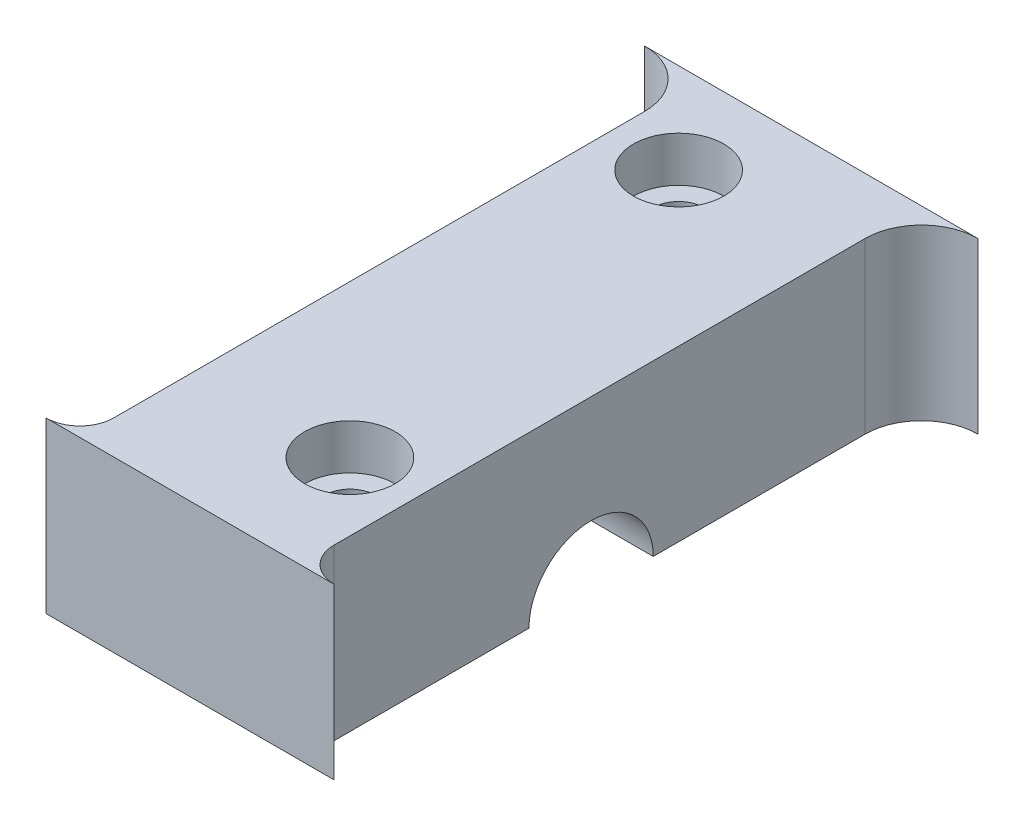
ISO-10303-21;
HEADER;
FILE_DESCRIPTION(('STEP AP214'),'2;1');
FILE_NAME('part.step','',(''),(''),'','','');
FILE_SCHEMA(('AUTOMOTIVE_DESIGN { 1 0 10303 214 1 1 1 1 }'));
ENDSEC;
DATA;
#1=APPLICATION_CONTEXT('core data for automotive mechanical design processes');
#2=APPLICATION_PROTOCOL_DEFINITION('international standard','automotive_design',2000,#1);
#3=PRODUCT_CONTEXT('',#1,'mechanical');
#4=PRODUCT('Part','Part','',(#3));
#5=PRODUCT_RELATED_PRODUCT_CATEGORY('part','',(#4));
#6=PRODUCT_DEFINITION_FORMATION('','',#4);
#7=PRODUCT_DEFINITION_CONTEXT('part definition',#1,'design');
#8=PRODUCT_DEFINITION('design','',#6,#7);
#9=PRODUCT_DEFINITION_SHAPE('','',#8);
#10=(LENGTH_UNIT() NAMED_UNIT(*) SI_UNIT(.MILLI.,.METRE.));
#11=(NAMED_UNIT(*) PLANE_ANGLE_UNIT() SI_UNIT($,.RADIAN.));
#12=(NAMED_UNIT(*) SI_UNIT($,.STERADIAN.) SOLID_ANGLE_UNIT());
#13=UNCERTAINTY_MEASURE_WITH_UNIT(LENGTH_MEASURE(1.E-05),#10,'distance_accuracy_value','');
#14=(GEOMETRIC_REPRESENTATION_CONTEXT(3) GLOBAL_UNCERTAINTY_ASSIGNED_CONTEXT((#13)) GLOBAL_UNIT_ASSIGNED_CONTEXT((#10,
#11,#12)) REPRESENTATION_CONTEXT('',''));
#15=CARTESIAN_POINT('',(0.,0.,0.));
#16=DIRECTION('',(0.,0.,1.));
#17=DIRECTION('',(1.,0.,0.));
#18=AXIS2_PLACEMENT_3D('',#15,#16,#17);
#19=CARTESIAN_POINT('',(-2.00000000000001,0.,-25.75));
#20=DIRECTION('',(1.,0.,0.));
#21=DIRECTION('',(0.,0.,-1.));
#22=AXIS2_PLACEMENT_3D('',#19,#20,#21);
#23=CYLINDRICAL_SURFACE('',#22,5.5);
#24=CARTESIAN_POINT('',(10.75,0.,-25.75));
#25=DIRECTION('',(1.,0.,0.));
#26=DIRECTION('',(0.,0.,-1.));
#27=AXIS2_PLACEMENT_3D('',#24,#25,#26);
#28=CIRCLE('',#27,5.5);
#29=CARTESIAN_POINT('',(10.75,0.,-20.25));
#30=VERTEX_POINT('',#29);
#31=CARTESIAN_POINT('',(10.75,0.,-31.25));
#32=VERTEX_POINT('',#31);
#33=EDGE_CURVE('E143',#30,#32,#28,.F.);
#34=ORIENTED_EDGE('',*,*,#33,.F.);
#35=DIRECTION('',(1.,0.,0.));
#36=VECTOR('',#35,1.);
#37=CARTESIAN_POINT('',(-2.00000000000001,0.,-20.25));
#38=LINE('',#37,#36);
#39=CARTESIAN_POINT('',(3.,0.,-20.25));
#40=VERTEX_POINT('',#39);
#41=EDGE_CURVE('E240',#40,#30,#38,.T.);
#42=ORIENTED_EDGE('',*,*,#41,.F.);
#43=CARTESIAN_POINT('',(3.,0.,-25.75));
#44=DIRECTION('',(1.,0.,0.));
#45=DIRECTION('',(0.,0.,-1.));
#46=AXIS2_PLACEMENT_3D('',#43,#44,#45);
#47=CIRCLE('',#46,5.5);
#48=CARTESIAN_POINT('',(3.,0.,-31.25));
#49=VERTEX_POINT('',#48);
#50=EDGE_CURVE('E170',#49,#40,#47,.T.);
#51=ORIENTED_EDGE('',*,*,#50,.F.);
#52=DIRECTION('',(1.,0.,0.));
#53=VECTOR('',#52,1.);
#54=CARTESIAN_POINT('',(-2.00000000000001,0.,-31.25));
#55=LINE('',#54,#53);
#56=EDGE_CURVE('E62',#32,#49,#55,.F.);
#57=ORIENTED_EDGE('',*,*,#56,.F.);
#58=EDGE_LOOP('',(#34,#42,#51,#57));
#59=FACE_BOUND('',#58,.T.);
#60=ADVANCED_FACE('F39',(#59),#23,.F.);
#61=CARTESIAN_POINT('',(0.,0.,-3.));
#62=DIRECTION('',(0.,1.,0.));
#63=DIRECTION('',(0.,0.,1.));
#64=AXIS2_PLACEMENT_3D('',#61,#62,#63);
#65=PLANE('',#64);
#66=CARTESIAN_POINT('',(16.5,0.,-10.4));
#67=DIRECTION('',(0.,1.,0.));
#68=DIRECTION('',(0.,0.,1.));
#69=AXIS2_PLACEMENT_3D('',#66,#67,#68);
#70=CIRCLE('',#69,2.25);
#71=CARTESIAN_POINT('',(16.5,0.,-8.15));
#72=VERTEX_POINT('',#71);
#73=EDGE_CURVE('E357',#72,#72,#70,.T.);
#74=ORIENTED_EDGE('',*,*,#73,.T.);
#75=EDGE_LOOP('',(#74));
#76=FACE_BOUND('',#75,.T.);
#77=DIRECTION('',(-1.,0.,0.));
#78=VECTOR('',#77,1.);
#79=CARTESIAN_POINT('',(14.75,0.,-14.25));
#80=LINE('',#79,#78);
#81=CARTESIAN_POINT('',(14.75,0.,-14.25));
#82=VERTEX_POINT('',#81);
#83=CARTESIAN_POINT('',(10.75,0.,-14.25));
#84=VERTEX_POINT('',#83);
#85=EDGE_CURVE('E152',#82,#84,#80,.T.);
#86=ORIENTED_EDGE('',*,*,#85,.F.);
#87=DIRECTION('',(0.,0.,-1.));
#88=VECTOR('',#87,1.);
#89=CARTESIAN_POINT('',(14.75,0.,-3.));
#90=LINE('',#89,#88);
#91=CARTESIAN_POINT('',(14.75,0.,-20.25));
#92=VERTEX_POINT('',#91);
#93=EDGE_CURVE('E163',#82,#92,#90,.T.);
#94=ORIENTED_EDGE('',*,*,#93,.T.);
#95=CARTESIAN_POINT('',(22.5,0.,-20.25));
#96=VERTEX_POINT('',#95);
#97=EDGE_CURVE('E239',#92,#96,#38,.T.);
#98=ORIENTED_EDGE('',*,*,#97,.T.);
#99=DIRECTION('',(0.,0.,-1.));
#100=VECTOR('',#99,1.);
#101=CARTESIAN_POINT('',(22.5,0.,-50.));
#102=LINE('',#101,#100);
#103=CARTESIAN_POINT('',(22.5,0.,-3.));
#104=VERTEX_POINT('',#103);
#105=EDGE_CURVE('E203',#104,#96,#102,.T.);
#106=ORIENTED_EDGE('',*,*,#105,.F.);
#107=CARTESIAN_POINT('',(25.5,0.,-3.));
#108=DIRECTION('',(0.,-1.,0.));
#109=DIRECTION('',(0.,0.,-1.));
#110=AXIS2_PLACEMENT_3D('',#107,#108,#109);
#111=CIRCLE('',#110,3.);
#112=CARTESIAN_POINT('',(25.5,0.,0.));
#113=VERTEX_POINT('',#112);
#114=EDGE_CURVE('E200',#113,#104,#111,.T.);
#115=ORIENTED_EDGE('',*,*,#114,.F.);
#116=DIRECTION('',(1.,0.,0.));
#117=VECTOR('',#116,1.);
#118=CARTESIAN_POINT('',(0.,0.,0.));
#119=LINE('',#118,#117);
#120=CARTESIAN_POINT('',(0.,0.,0.));
#121=VERTEX_POINT('',#120);
#122=EDGE_CURVE('E198',#121,#113,#119,.T.);
#123=ORIENTED_EDGE('',*,*,#122,.F.);
#124=CARTESIAN_POINT('',(0.,0.,-3.));
#125=DIRECTION('',(0.,-1.,0.));
#126=DIRECTION('',(0.,0.,1.));
#127=AXIS2_PLACEMENT_3D('',#124,#125,#126);
#128=CIRCLE('',#127,3.);
#129=CARTESIAN_POINT('',(3.,0.,-3.));
#130=VERTEX_POINT('',#129);
#131=EDGE_CURVE('E176',#130,#121,#128,.T.);
#132=ORIENTED_EDGE('',*,*,#131,.F.);
#133=DIRECTION('',(0.,0.,1.));
#134=VECTOR('',#133,1.);
#135=CARTESIAN_POINT('',(2.99999999999999,0.,-50.));
#136=LINE('',#135,#134);
#137=EDGE_CURVE('E212',#40,#130,#136,.T.);
#138=ORIENTED_EDGE('',*,*,#137,.F.);
#139=ORIENTED_EDGE('',*,*,#41,.T.);
#140=DIRECTION('',(0.,0.,-1.));
#141=VECTOR('',#140,1.);
#142=CARTESIAN_POINT('',(10.75,0.,-3.));
#143=LINE('',#142,#141);
#144=EDGE_CURVE('E54',#84,#30,#143,.T.);
#145=ORIENTED_EDGE('',*,*,#144,.F.);
#146=EDGE_LOOP('',(#86,#94,#98,#106,#115,#123,#132,#138,#139,#145));
#147=FACE_BOUND('',#146,.T.);
#148=ADVANCED_FACE('F249',(#76,#147),#65,.F.);
#149=CARTESIAN_POINT('',(0.,15.,-3.));
#150=DIRECTION('',(0.,-1.,0.));
#151=DIRECTION('',(0.,0.,-1.));
#152=AXIS2_PLACEMENT_3D('',#149,#150,#151);
#153=CYLINDRICAL_SURFACE('',#152,3.);
#154=ORIENTED_EDGE('',*,*,#131,.T.);
#155=DIRECTION('',(0.,-1.,0.));
#156=VECTOR('',#155,1.);
#157=CARTESIAN_POINT('',(0.,15.,0.));
#158=LINE('',#157,#156);
#159=CARTESIAN_POINT('',(0.,15.,0.));
#160=VERTEX_POINT('',#159);
#161=EDGE_CURVE('E235',#160,#121,#158,.T.);
#162=ORIENTED_EDGE('',*,*,#161,.F.);
#163=CARTESIAN_POINT('',(0.,15.,-3.));
#164=DIRECTION('',(0.,-1.,0.));
#165=DIRECTION('',(0.,0.,1.));
#166=AXIS2_PLACEMENT_3D('',#163,#164,#165);
#167=CIRCLE('',#166,3.);
#168=CARTESIAN_POINT('',(3.,15.,-3.));
#169=VERTEX_POINT('',#168);
#170=EDGE_CURVE('E177',#169,#160,#167,.T.);
#171=ORIENTED_EDGE('',*,*,#170,.F.);
#172=DIRECTION('',(0.,-1.,0.));
#173=VECTOR('',#172,1.);
#174=CARTESIAN_POINT('',(3.,15.,-3.));
#175=LINE('',#174,#173);
#176=EDGE_CURVE('E195',#169,#130,#175,.T.);
#177=ORIENTED_EDGE('',*,*,#176,.T.);
#178=EDGE_LOOP('',(#154,#162,#171,#177));
#179=FACE_BOUND('',#178,.T.);
#180=ADVANCED_FACE('F41',(#179),#153,.F.);
#181=CARTESIAN_POINT('',(0.,15.,0.));
#182=DIRECTION('',(0.,0.,-1.));
#183=DIRECTION('',(-1.,0.,0.));
#184=AXIS2_PLACEMENT_3D('',#181,#182,#183);
#185=PLANE('',#184);
#186=ORIENTED_EDGE('',*,*,#122,.T.);
#187=DIRECTION('',(0.,-1.,0.));
#188=VECTOR('',#187,1.);
#189=CARTESIAN_POINT('',(25.5,15.,0.));
#190=LINE('',#189,#188);
#191=CARTESIAN_POINT('',(25.5,15.,0.));
#192=VERTEX_POINT('',#191);
#193=EDGE_CURVE('E232',#192,#113,#190,.T.);
#194=ORIENTED_EDGE('',*,*,#193,.F.);
#195=DIRECTION('',(1.,0.,0.));
#196=VECTOR('',#195,1.);
#197=CARTESIAN_POINT('',(0.,15.,0.));
#198=LINE('',#197,#196);
#199=EDGE_CURVE('E180',#160,#192,#198,.T.);
#200=ORIENTED_EDGE('',*,*,#199,.F.);
#201=ORIENTED_EDGE('',*,*,#161,.T.);
#202=EDGE_LOOP('',(#186,#194,#200,#201));
#203=FACE_BOUND('',#202,.T.);
#204=ADVANCED_FACE('F284',(#203),#185,.F.);
#205=CARTESIAN_POINT('',(25.5,15.,-3.));
#206=DIRECTION('',(0.,-1.,0.));
#207=DIRECTION('',(0.,0.,-1.));
#208=AXIS2_PLACEMENT_3D('',#205,#206,#207);
#209=CYLINDRICAL_SURFACE('',#208,3.);
#210=ORIENTED_EDGE('',*,*,#114,.T.);
#211=DIRECTION('',(0.,-1.,0.));
#212=VECTOR('',#211,1.);
#213=CARTESIAN_POINT('',(22.5,15.,-3.));
#214=LINE('',#213,#212);
#215=CARTESIAN_POINT('',(22.5,15.,-3.));
#216=VERTEX_POINT('',#215);
#217=EDGE_CURVE('E229',#216,#104,#214,.T.);
#218=ORIENTED_EDGE('',*,*,#217,.F.);
#219=CARTESIAN_POINT('',(25.5,15.,-3.));
#220=DIRECTION('',(0.,-1.,0.));
#221=DIRECTION('',(0.,0.,-1.));
#222=AXIS2_PLACEMENT_3D('',#219,#220,#221);
#223=CIRCLE('',#222,3.);
#224=EDGE_CURVE('E183',#192,#216,#223,.T.);
#225=ORIENTED_EDGE('',*,*,#224,.F.);
#226=ORIENTED_EDGE('',*,*,#193,.T.);
#227=EDGE_LOOP('',(#210,#218,#225,#226));
#228=FACE_BOUND('',#227,.T.);
#229=ADVANCED_FACE('F280',(#228),#209,.F.);
#230=CARTESIAN_POINT('',(22.5,15.,-50.));
#231=DIRECTION('',(-1.,0.,0.));
#232=DIRECTION('',(0.,0.,1.));
#233=AXIS2_PLACEMENT_3D('',#230,#231,#232);
#234=PLANE('',#233);
#235=ORIENTED_EDGE('',*,*,#105,.T.);
#236=CARTESIAN_POINT('',(22.5,0.,-25.75));
#237=DIRECTION('',(-1.,0.,0.));
#238=DIRECTION('',(0.,0.,1.));
#239=AXIS2_PLACEMENT_3D('',#236,#237,#238);
#240=CIRCLE('',#239,5.5);
#241=CARTESIAN_POINT('',(22.5,0.,-31.25));
#242=VERTEX_POINT('',#241);
#243=EDGE_CURVE('E173',#96,#242,#240,.T.);
#244=ORIENTED_EDGE('',*,*,#243,.T.);
#245=CARTESIAN_POINT('',(22.5,0.,-50.));
#246=VERTEX_POINT('',#245);
#247=EDGE_CURVE('E202',#242,#246,#102,.T.);
#248=ORIENTED_EDGE('',*,*,#247,.T.);
#249=DIRECTION('',(0.,-1.,0.));
#250=VECTOR('',#249,1.);
#251=CARTESIAN_POINT('',(22.5,15.,-50.));
#252=LINE('',#251,#250);
#253=CARTESIAN_POINT('',(22.5,15.,-50.));
#254=VERTEX_POINT('',#253);
#255=EDGE_CURVE('E226',#254,#246,#252,.T.);
#256=ORIENTED_EDGE('',*,*,#255,.F.);
#257=DIRECTION('',(0.,0.,-1.));
#258=VECTOR('',#257,1.);
#259=CARTESIAN_POINT('',(22.5,15.,-50.));
#260=LINE('',#259,#258);
#261=EDGE_CURVE('E185',#216,#254,#260,.T.);
#262=ORIENTED_EDGE('',*,*,#261,.F.);
#263=ORIENTED_EDGE('',*,*,#217,.T.);
#264=EDGE_LOOP('',(#235,#244,#248,#256,#262,#263));
#265=FACE_BOUND('',#264,.T.);
#266=ADVANCED_FACE('F275',(#265),#234,.F.);
#267=CARTESIAN_POINT('',(27.5,15.,-50.));
#268=DIRECTION('',(0.,-1.,0.));
#269=DIRECTION('',(0.,0.,-1.));
#270=AXIS2_PLACEMENT_3D('',#267,#268,#269);
#271=CYLINDRICAL_SURFACE('',#270,5.);
#272=CARTESIAN_POINT('',(27.5,0.,-50.));
#273=DIRECTION('',(0.,-1.,0.));
#274=DIRECTION('',(0.,0.,1.));
#275=AXIS2_PLACEMENT_3D('',#272,#273,#274);
#276=CIRCLE('',#275,5.);
#277=CARTESIAN_POINT('',(27.5,0.,-55.));
#278=VERTEX_POINT('',#277);
#279=EDGE_CURVE('E206',#246,#278,#276,.T.);
#280=ORIENTED_EDGE('',*,*,#279,.T.);
#281=DIRECTION('',(0.,-1.,0.));
#282=VECTOR('',#281,1.);
#283=CARTESIAN_POINT('',(27.5,15.,-55.));
#284=LINE('',#283,#282);
#285=CARTESIAN_POINT('',(27.5,15.,-55.));
#286=VERTEX_POINT('',#285);
#287=EDGE_CURVE('E223',#286,#278,#284,.T.);
#288=ORIENTED_EDGE('',*,*,#287,.F.);
#289=CARTESIAN_POINT('',(27.5,15.,-50.));
#290=DIRECTION('',(0.,-1.,0.));
#291=DIRECTION('',(0.,0.,1.));
#292=AXIS2_PLACEMENT_3D('',#289,#290,#291);
#293=CIRCLE('',#292,5.);
#294=EDGE_CURVE('E187',#254,#286,#293,.T.);
#295=ORIENTED_EDGE('',*,*,#294,.F.);
#296=ORIENTED_EDGE('',*,*,#255,.T.);
#297=EDGE_LOOP('',(#280,#288,#295,#296));
#298=FACE_BOUND('',#297,.T.);
#299=ADVANCED_FACE('F272',(#298),#271,.F.);
#300=CARTESIAN_POINT('',(27.5,15.,-55.));
#301=DIRECTION('',(0.,0.,1.));
#302=DIRECTION('',(1.,0.,0.));
#303=AXIS2_PLACEMENT_3D('',#300,#301,#302);
#304=PLANE('',#303);
#305=DIRECTION('',(-1.,0.,0.));
#306=VECTOR('',#305,1.);
#307=CARTESIAN_POINT('',(27.5,0.,-55.));
#308=LINE('',#307,#306);
#309=CARTESIAN_POINT('',(-2.00000000000001,0.,-55.));
#310=VERTEX_POINT('',#309);
#311=EDGE_CURVE('E208',#278,#310,#308,.T.);
#312=ORIENTED_EDGE('',*,*,#311,.T.);
#313=DIRECTION('',(0.,-1.,0.));
#314=VECTOR('',#313,1.);
#315=CARTESIAN_POINT('',(-2.00000000000001,15.,-55.));
#316=LINE('',#315,#314);
#317=CARTESIAN_POINT('',(-2.00000000000001,15.,-55.));
#318=VERTEX_POINT('',#317);
#319=EDGE_CURVE('E220',#318,#310,#316,.T.);
#320=ORIENTED_EDGE('',*,*,#319,.F.);
#321=DIRECTION('',(-1.,0.,0.));
#322=VECTOR('',#321,1.);
#323=CARTESIAN_POINT('',(27.5,15.,-55.));
#324=LINE('',#323,#322);
#325=EDGE_CURVE('E189',#286,#318,#324,.T.);
#326=ORIENTED_EDGE('',*,*,#325,.F.);
#327=ORIENTED_EDGE('',*,*,#287,.T.);
#328=EDGE_LOOP('',(#312,#320,#326,#327));
#329=FACE_BOUND('',#328,.T.);
#330=ADVANCED_FACE('F268',(#329),#304,.F.);
#331=CARTESIAN_POINT('',(-2.,15.,-50.));
#332=DIRECTION('',(0.,-1.,0.));
#333=DIRECTION('',(0.,0.,-1.));
#334=AXIS2_PLACEMENT_3D('',#331,#332,#333);
#335=CYLINDRICAL_SURFACE('',#334,5.);
#336=CARTESIAN_POINT('',(-2.,0.,-50.));
#337=DIRECTION('',(0.,-1.,0.));
#338=DIRECTION('',(0.,0.,-1.));
#339=AXIS2_PLACEMENT_3D('',#336,#337,#338);
#340=CIRCLE('',#339,5.);
#341=CARTESIAN_POINT('',(2.99999999999999,0.,-50.));
#342=VERTEX_POINT('',#341);
#343=EDGE_CURVE('E210',#310,#342,#340,.T.);
#344=ORIENTED_EDGE('',*,*,#343,.T.);
#345=DIRECTION('',(0.,-1.,0.));
#346=VECTOR('',#345,1.);
#347=CARTESIAN_POINT('',(2.99999999999999,15.,-50.));
#348=LINE('',#347,#346);
#349=CARTESIAN_POINT('',(2.99999999999999,15.,-50.));
#350=VERTEX_POINT('',#349);
#351=EDGE_CURVE('E217',#350,#342,#348,.T.);
#352=ORIENTED_EDGE('',*,*,#351,.F.);
#353=CARTESIAN_POINT('',(-2.,15.,-50.));
#354=DIRECTION('',(0.,-1.,0.));
#355=DIRECTION('',(0.,0.,-1.));
#356=AXIS2_PLACEMENT_3D('',#353,#354,#355);
#357=CIRCLE('',#356,5.);
#358=EDGE_CURVE('E191',#318,#350,#357,.T.);
#359=ORIENTED_EDGE('',*,*,#358,.F.);
#360=ORIENTED_EDGE('',*,*,#319,.T.);
#361=EDGE_LOOP('',(#344,#352,#359,#360));
#362=FACE_BOUND('',#361,.T.);
#363=ADVANCED_FACE('F263',(#362),#335,.F.);
#364=CARTESIAN_POINT('',(2.99999999999999,15.,-50.));
#365=DIRECTION('',(1.,0.,0.));
#366=DIRECTION('',(0.,0.,-1.));
#367=AXIS2_PLACEMENT_3D('',#364,#365,#366);
#368=PLANE('',#367);
#369=EDGE_CURVE('E181',#342,#49,#136,.T.);
#370=ORIENTED_EDGE('',*,*,#369,.T.);
#371=ORIENTED_EDGE('',*,*,#50,.T.);
#372=ORIENTED_EDGE('',*,*,#137,.T.);
#373=ORIENTED_EDGE('',*,*,#176,.F.);
#374=DIRECTION('',(0.,0.,1.));
#375=VECTOR('',#374,1.);
#376=CARTESIAN_POINT('',(2.99999999999999,15.,-50.));
#377=LINE('',#376,#375);
#378=EDGE_CURVE('E193',#350,#169,#377,.T.);
#379=ORIENTED_EDGE('',*,*,#378,.F.);
#380=ORIENTED_EDGE('',*,*,#351,.T.);
#381=EDGE_LOOP('',(#370,#371,#372,#373,#379,#380));
#382=FACE_BOUND('',#381,.T.);
#383=ADVANCED_FACE('F255',(#382),#368,.F.);
#384=CARTESIAN_POINT('',(0.,15.,-3.));
#385=DIRECTION('',(0.,1.,0.));
#386=DIRECTION('',(0.,0.,1.));
#387=AXIS2_PLACEMENT_3D('',#384,#385,#386);
#388=PLANE('',#387);
#389=CARTESIAN_POINT('',(16.5,15.,-10.4));
#390=DIRECTION('',(0.,1.,0.));
#391=DIRECTION('',(0.,0.,1.));
#392=AXIS2_PLACEMENT_3D('',#389,#390,#391);
#393=CIRCLE('',#392,4.);
#394=CARTESIAN_POINT('',(16.5,15.,-6.4));
#395=VERTEX_POINT('',#394);
#396=EDGE_CURVE('E350',#395,#395,#393,.T.);
#397=ORIENTED_EDGE('',*,*,#396,.F.);
#398=EDGE_LOOP('',(#397));
#399=FACE_BOUND('',#398,.T.);
#400=CARTESIAN_POINT('',(8.99999999999999,15.,-47.));
#401=DIRECTION('',(0.,1.,0.));
#402=DIRECTION('',(0.,0.,1.));
#403=AXIS2_PLACEMENT_3D('',#400,#401,#402);
#404=CIRCLE('',#403,4.);
#405=CARTESIAN_POINT('',(8.99999999999999,15.,-43.));
#406=VERTEX_POINT('',#405);
#407=EDGE_CURVE('E360',#406,#406,#404,.T.);
#408=ORIENTED_EDGE('',*,*,#407,.F.);
#409=EDGE_LOOP('',(#408));
#410=FACE_BOUND('',#409,.T.);
#411=ORIENTED_EDGE('',*,*,#170,.T.);
#412=ORIENTED_EDGE('',*,*,#199,.T.);
#413=ORIENTED_EDGE('',*,*,#224,.T.);
#414=ORIENTED_EDGE('',*,*,#261,.T.);
#415=ORIENTED_EDGE('',*,*,#294,.T.);
#416=ORIENTED_EDGE('',*,*,#325,.T.);
#417=ORIENTED_EDGE('',*,*,#358,.T.);
#418=ORIENTED_EDGE('',*,*,#378,.T.);
#419=EDGE_LOOP('',(#411,#412,#413,#414,#415,#416,#417,#418));
#420=FACE_BOUND('',#419,.T.);
#421=ADVANCED_FACE('F289',(#399,#410,#420),#388,.T.);
#422=CARTESIAN_POINT('',(8.99999999999999,0.,-47.));
#423=DIRECTION('',(0.,1.,0.));
#424=DIRECTION('',(0.,0.,1.));
#425=AXIS2_PLACEMENT_3D('',#422,#423,#424);
#426=CIRCLE('',#425,2.25);
#427=CARTESIAN_POINT('',(8.99999999999999,0.,-44.75));
#428=VERTEX_POINT('',#427);
#429=EDGE_CURVE('E153',#428,#428,#426,.T.);
#430=ORIENTED_EDGE('',*,*,#429,.T.);
#431=EDGE_LOOP('',(#430));
#432=FACE_BOUND('',#431,.T.);
#433=CARTESIAN_POINT('',(14.75,0.,-31.25));
#434=VERTEX_POINT('',#433);
#435=EDGE_CURVE('E160',#242,#434,#55,.F.);
#436=ORIENTED_EDGE('',*,*,#435,.T.);
#437=DIRECTION('',(0.,0.,-1.));
#438=VECTOR('',#437,1.);
#439=CARTESIAN_POINT('',(14.75,0.,-3.));
#440=LINE('',#439,#438);
#441=CARTESIAN_POINT('',(14.75,0.,-37.25));
#442=VERTEX_POINT('',#441);
#443=EDGE_CURVE('E158',#434,#442,#440,.T.);
#444=ORIENTED_EDGE('',*,*,#443,.T.);
#445=DIRECTION('',(-1.,0.,0.));
#446=VECTOR('',#445,1.);
#447=CARTESIAN_POINT('',(14.75,0.,-37.25));
#448=LINE('',#447,#446);
#449=CARTESIAN_POINT('',(10.75,0.,-37.25));
#450=VERTEX_POINT('',#449);
#451=EDGE_CURVE('E11',#450,#442,#448,.F.);
#452=ORIENTED_EDGE('',*,*,#451,.F.);
#453=DIRECTION('',(0.,0.,-1.));
#454=VECTOR('',#453,1.);
#455=CARTESIAN_POINT('',(10.75,0.,-3.));
#456=LINE('',#455,#454);
#457=EDGE_CURVE('E139',#32,#450,#456,.T.);
#458=ORIENTED_EDGE('',*,*,#457,.F.);
#459=ORIENTED_EDGE('',*,*,#56,.T.);
#460=ORIENTED_EDGE('',*,*,#369,.F.);
#461=ORIENTED_EDGE('',*,*,#343,.F.);
#462=ORIENTED_EDGE('',*,*,#311,.F.);
#463=ORIENTED_EDGE('',*,*,#279,.F.);
#464=ORIENTED_EDGE('',*,*,#247,.F.);
#465=EDGE_LOOP('',(#436,#444,#452,#458,#459,#460,#461,#462,#463,#464));
#466=FACE_BOUND('',#465,.T.);
#467=ADVANCED_FACE('F157',(#432,#466),#65,.F.);
#468=ORIENTED_EDGE('',*,*,#97,.F.);
#469=CARTESIAN_POINT('',(14.75,0.,-25.75));
#470=DIRECTION('',(1.,0.,0.));
#471=DIRECTION('',(0.,0.,-1.));
#472=AXIS2_PLACEMENT_3D('',#469,#470,#471);
#473=CIRCLE('',#472,5.5);
#474=EDGE_CURVE('E47',#92,#434,#473,.F.);
#475=ORIENTED_EDGE('',*,*,#474,.T.);
#476=ORIENTED_EDGE('',*,*,#435,.F.);
#477=ORIENTED_EDGE('',*,*,#243,.F.);
#478=EDGE_LOOP('',(#468,#475,#476,#477));
#479=FACE_BOUND('',#478,.T.);
#480=ADVANCED_FACE('F245',(#479),#23,.F.);
#481=CARTESIAN_POINT('',(14.75,0.,-25.75));
#482=DIRECTION('',(-1.,0.,0.));
#483=DIRECTION('',(0.,0.,1.));
#484=AXIS2_PLACEMENT_3D('',#481,#482,#483);
#485=CYLINDRICAL_SURFACE('',#484,11.5);
#486=ORIENTED_EDGE('',*,*,#85,.T.);
#487=CARTESIAN_POINT('',(10.75,0.,-25.75));
#488=DIRECTION('',(1.,0.,0.));
#489=DIRECTION('',(0.,0.,-1.));
#490=AXIS2_PLACEMENT_3D('',#487,#488,#489);
#491=CIRCLE('',#490,11.5);
#492=EDGE_CURVE('E142',#450,#84,#491,.T.);
#493=ORIENTED_EDGE('',*,*,#492,.F.);
#494=ORIENTED_EDGE('',*,*,#451,.T.);
#495=CARTESIAN_POINT('',(14.75,0.,-25.75));
#496=DIRECTION('',(1.,0.,0.));
#497=DIRECTION('',(0.,0.,-1.));
#498=AXIS2_PLACEMENT_3D('',#495,#496,#497);
#499=CIRCLE('',#498,11.5);
#500=EDGE_CURVE('E145',#442,#82,#499,.T.);
#501=ORIENTED_EDGE('',*,*,#500,.T.);
#502=EDGE_LOOP('',(#486,#493,#494,#501));
#503=FACE_BOUND('',#502,.T.);
#504=ADVANCED_FACE('F148',(#503),#485,.F.);
#505=CARTESIAN_POINT('',(14.75,0.,-25.75));
#506=DIRECTION('',(1.,0.,0.));
#507=DIRECTION('',(0.,0.,-1.));
#508=AXIS2_PLACEMENT_3D('',#505,#506,#507);
#509=PLANE('',#508);
#510=ORIENTED_EDGE('',*,*,#500,.F.);
#511=ORIENTED_EDGE('',*,*,#443,.F.);
#512=ORIENTED_EDGE('',*,*,#474,.F.);
#513=ORIENTED_EDGE('',*,*,#93,.F.);
#514=EDGE_LOOP('',(#510,#511,#512,#513));
#515=FACE_BOUND('',#514,.T.);
#516=ADVANCED_FACE('F247',(#515),#509,.F.);
#517=CARTESIAN_POINT('',(10.75,0.,-25.75));
#518=DIRECTION('',(1.,0.,0.));
#519=DIRECTION('',(0.,0.,-1.));
#520=AXIS2_PLACEMENT_3D('',#517,#518,#519);
#521=PLANE('',#520);
#522=ORIENTED_EDGE('',*,*,#144,.T.);
#523=ORIENTED_EDGE('',*,*,#33,.T.);
#524=ORIENTED_EDGE('',*,*,#457,.T.);
#525=ORIENTED_EDGE('',*,*,#492,.T.);
#526=EDGE_LOOP('',(#522,#523,#524,#525));
#527=FACE_BOUND('',#526,.T.);
#528=ADVANCED_FACE('F141',(#527),#521,.T.);
#529=CARTESIAN_POINT('',(8.99999999999999,15.,-47.));
#530=DIRECTION('',(0.,1.,0.));
#531=DIRECTION('',(0.,0.,1.));
#532=AXIS2_PLACEMENT_3D('',#529,#530,#531);
#533=CYLINDRICAL_SURFACE('',#532,2.25);
#534=ORIENTED_EDGE('',*,*,#429,.F.);
#535=EDGE_LOOP('',(#534));
#536=FACE_BOUND('',#535,.T.);
#537=CARTESIAN_POINT('',(8.99999999999999,11.,-47.));
#538=DIRECTION('',(0.,1.,0.));
#539=DIRECTION('',(0.,0.,1.));
#540=AXIS2_PLACEMENT_3D('',#537,#538,#539);
#541=CIRCLE('',#540,2.25);
#542=CARTESIAN_POINT('',(8.99999999999999,11.,-44.75));
#543=VERTEX_POINT('',#542);
#544=EDGE_CURVE('E366',#543,#543,#541,.T.);
#545=ORIENTED_EDGE('',*,*,#544,.T.);
#546=EDGE_LOOP('',(#545));
#547=FACE_BOUND('',#546,.T.);
#548=ADVANCED_FACE('F320',(#536,#547),#533,.F.);
#549=CARTESIAN_POINT('',(11.25,11.,-47.));
#550=DIRECTION('',(0.,-1.,0.));
#551=DIRECTION('',(0.,0.,-1.));
#552=AXIS2_PLACEMENT_3D('',#549,#550,#551);
#553=PLANE('',#552);
#554=ORIENTED_EDGE('',*,*,#544,.F.);
#555=EDGE_LOOP('',(#554));
#556=FACE_BOUND('',#555,.T.);
#557=CARTESIAN_POINT('',(8.99999999999999,11.,-47.));
#558=DIRECTION('',(0.,1.,0.));
#559=DIRECTION('',(0.,0.,1.));
#560=AXIS2_PLACEMENT_3D('',#557,#558,#559);
#561=CIRCLE('',#560,4.);
#562=CARTESIAN_POINT('',(8.99999999999999,11.,-43.));
#563=VERTEX_POINT('',#562);
#564=EDGE_CURVE('E363',#563,#563,#561,.T.);
#565=ORIENTED_EDGE('',*,*,#564,.T.);
#566=EDGE_LOOP('',(#565));
#567=FACE_BOUND('',#566,.T.);
#568=ADVANCED_FACE('F323',(#556,#567),#553,.F.);
#569=CARTESIAN_POINT('',(8.99999999999999,15.,-47.));
#570=DIRECTION('',(0.,1.,0.));
#571=DIRECTION('',(0.,0.,1.));
#572=AXIS2_PLACEMENT_3D('',#569,#570,#571);
#573=CYLINDRICAL_SURFACE('',#572,4.);
#574=ORIENTED_EDGE('',*,*,#564,.F.);
#575=EDGE_LOOP('',(#574));
#576=FACE_BOUND('',#575,.T.);
#577=ORIENTED_EDGE('',*,*,#407,.T.);
#578=EDGE_LOOP('',(#577));
#579=FACE_BOUND('',#578,.T.);
#580=ADVANCED_FACE('F327',(#576,#579),#573,.F.);
#581=CARTESIAN_POINT('',(16.5,15.,-10.4));
#582=DIRECTION('',(0.,1.,0.));
#583=DIRECTION('',(0.,0.,1.));
#584=AXIS2_PLACEMENT_3D('',#581,#582,#583);
#585=CYLINDRICAL_SURFACE('',#584,2.25);
#586=ORIENTED_EDGE('',*,*,#73,.F.);
#587=EDGE_LOOP('',(#586));
#588=FACE_BOUND('',#587,.T.);
#589=CARTESIAN_POINT('',(16.5,11.,-10.4));
#590=DIRECTION('',(0.,1.,0.));
#591=DIRECTION('',(0.,0.,1.));
#592=AXIS2_PLACEMENT_3D('',#589,#590,#591);
#593=CIRCLE('',#592,2.25);
#594=CARTESIAN_POINT('',(16.5,11.,-8.15));
#595=VERTEX_POINT('',#594);
#596=EDGE_CURVE('E352',#595,#595,#593,.T.);
#597=ORIENTED_EDGE('',*,*,#596,.T.);
#598=EDGE_LOOP('',(#597));
#599=FACE_BOUND('',#598,.T.);
#600=ADVANCED_FACE('F331',(#588,#599),#585,.F.);
#601=CARTESIAN_POINT('',(18.75,11.,-10.4));
#602=DIRECTION('',(0.,-1.,0.));
#603=DIRECTION('',(0.,0.,-1.));
#604=AXIS2_PLACEMENT_3D('',#601,#602,#603);
#605=PLANE('',#604);
#606=ORIENTED_EDGE('',*,*,#596,.F.);
#607=EDGE_LOOP('',(#606));
#608=FACE_BOUND('',#607,.T.);
#609=CARTESIAN_POINT('',(16.5,11.,-10.4));
#610=DIRECTION('',(0.,1.,0.));
#611=DIRECTION('',(0.,0.,1.));
#612=AXIS2_PLACEMENT_3D('',#609,#610,#611);
#613=CIRCLE('',#612,4.);
#614=CARTESIAN_POINT('',(16.5,11.,-6.4));
#615=VERTEX_POINT('',#614);
#616=EDGE_CURVE('E348',#615,#615,#613,.T.);
#617=ORIENTED_EDGE('',*,*,#616,.T.);
#618=EDGE_LOOP('',(#617));
#619=FACE_BOUND('',#618,.T.);
#620=ADVANCED_FACE('F335',(#608,#619),#605,.F.);
#621=CARTESIAN_POINT('',(16.5,15.,-10.4));
#622=DIRECTION('',(0.,1.,0.));
#623=DIRECTION('',(0.,0.,1.));
#624=AXIS2_PLACEMENT_3D('',#621,#622,#623);
#625=CYLINDRICAL_SURFACE('',#624,4.);
#626=ORIENTED_EDGE('',*,*,#616,.F.);
#627=EDGE_LOOP('',(#626));
#628=FACE_BOUND('',#627,.T.);
#629=ORIENTED_EDGE('',*,*,#396,.T.);
#630=EDGE_LOOP('',(#629));
#631=FACE_BOUND('',#630,.T.);
#632=ADVANCED_FACE('F339',(#628,#631),#625,.F.);
#633=CLOSED_SHELL('',(#60,#148,#180,#204,#229,#266,#299,#330,#363,#383,#421,#467,#480,#504,#516,
#528,#548,#568,#580,#600,#620,#632));
#634=MANIFOLD_SOLID_BREP('B2',#633);
#635=ADVANCED_BREP_SHAPE_REPRESENTATION('',(#18,#634),#14);
#636=SHAPE_DEFINITION_REPRESENTATION(#9,#635);
ENDSEC;
END-ISO-10303-21;
